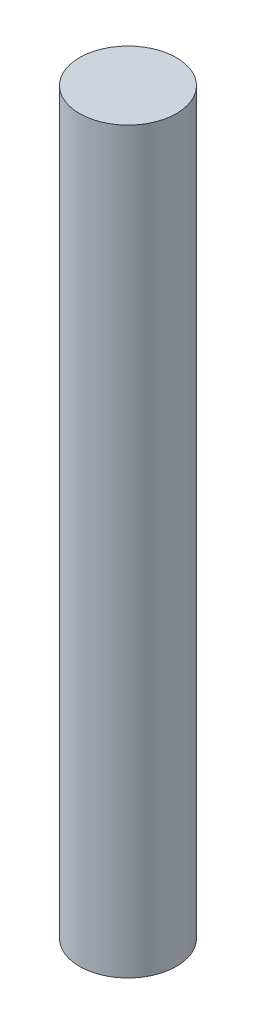
ISO-10303-21;
HEADER;
FILE_DESCRIPTION(('STEP AP214'),'2;1');
FILE_NAME('part.step','',(''),(''),'','','');
FILE_SCHEMA(('AUTOMOTIVE_DESIGN { 1 0 10303 214 1 1 1 1 }'));
ENDSEC;
DATA;
#1=APPLICATION_CONTEXT('core data for automotive mechanical design processes');
#2=APPLICATION_PROTOCOL_DEFINITION('international standard','automotive_design',2000,#1);
#3=PRODUCT_CONTEXT('',#1,'mechanical');
#4=PRODUCT('Part','Part','',(#3));
#5=PRODUCT_RELATED_PRODUCT_CATEGORY('part','',(#4));
#6=PRODUCT_DEFINITION_FORMATION('','',#4);
#7=PRODUCT_DEFINITION_CONTEXT('part definition',#1,'design');
#8=PRODUCT_DEFINITION('design','',#6,#7);
#9=PRODUCT_DEFINITION_SHAPE('','',#8);
#10=(LENGTH_UNIT() NAMED_UNIT(*) SI_UNIT(.MILLI.,.METRE.));
#11=(NAMED_UNIT(*) PLANE_ANGLE_UNIT() SI_UNIT($,.RADIAN.));
#12=(NAMED_UNIT(*) SI_UNIT($,.STERADIAN.) SOLID_ANGLE_UNIT());
#13=UNCERTAINTY_MEASURE_WITH_UNIT(LENGTH_MEASURE(1.E-05),#10,'distance_accuracy_value','');
#14=(GEOMETRIC_REPRESENTATION_CONTEXT(3) GLOBAL_UNCERTAINTY_ASSIGNED_CONTEXT((#13)) GLOBAL_UNIT_ASSIGNED_CONTEXT((#10,
#11,#12)) REPRESENTATION_CONTEXT('',''));
#15=CARTESIAN_POINT('',(0.,0.,0.));
#16=DIRECTION('',(0.,0.,1.));
#17=DIRECTION('',(1.,0.,0.));
#18=AXIS2_PLACEMENT_3D('',#15,#16,#17);
#19=CARTESIAN_POINT('',(0.,190.5,0.));
#20=DIRECTION('',(0.,-1.,0.));
#21=DIRECTION('',(0.,0.,-1.));
#22=AXIS2_PLACEMENT_3D('',#19,#20,#21);
#23=CYLINDRICAL_SURFACE('',#22,12.5);
#24=CARTESIAN_POINT('',(0.,190.5,0.));
#25=DIRECTION('',(0.,1.,0.));
#26=DIRECTION('',(0.,0.,1.));
#27=AXIS2_PLACEMENT_3D('',#24,#25,#26);
#28=CIRCLE('',#27,12.5);
#29=CARTESIAN_POINT('',(0.,190.5,12.5));
#30=VERTEX_POINT('',#29);
#31=EDGE_CURVE('E10',#30,#30,#28,.T.);
#32=ORIENTED_EDGE('',*,*,#31,.F.);
#33=EDGE_LOOP('',(#32));
#34=FACE_BOUND('',#33,.T.);
#35=CARTESIAN_POINT('',(0.,0.,0.));
#36=DIRECTION('',(0.,1.,0.));
#37=DIRECTION('',(0.,0.,1.));
#38=AXIS2_PLACEMENT_3D('',#35,#36,#37);
#39=CIRCLE('',#38,12.5);
#40=CARTESIAN_POINT('',(0.,0.,12.5));
#41=VERTEX_POINT('',#40);
#42=EDGE_CURVE('E40',#41,#41,#39,.T.);
#43=ORIENTED_EDGE('',*,*,#42,.T.);
#44=EDGE_LOOP('',(#43));
#45=FACE_BOUND('',#44,.T.);
#46=ADVANCED_FACE('F37',(#34,#45),#23,.T.);
#47=CARTESIAN_POINT('',(0.,190.5,0.));
#48=DIRECTION('',(0.,1.,0.));
#49=DIRECTION('',(0.,0.,1.));
#50=AXIS2_PLACEMENT_3D('',#47,#48,#49);
#51=PLANE('',#50);
#52=ORIENTED_EDGE('',*,*,#31,.T.);
#53=EDGE_LOOP('',(#52));
#54=FACE_BOUND('',#53,.T.);
#55=ADVANCED_FACE('F52',(#54),#51,.T.);
#56=CARTESIAN_POINT('',(0.,0.,0.));
#57=DIRECTION('',(0.,1.,0.));
#58=DIRECTION('',(0.,0.,1.));
#59=AXIS2_PLACEMENT_3D('',#56,#57,#58);
#60=PLANE('',#59);
#61=ORIENTED_EDGE('',*,*,#42,.F.);
#62=EDGE_LOOP('',(#61));
#63=FACE_BOUND('',#62,.T.);
#64=ADVANCED_FACE('F50',(#63),#60,.F.);
#65=CLOSED_SHELL('',(#46,#55,#64));
#66=MANIFOLD_SOLID_BREP('B2',#65);
#67=ADVANCED_BREP_SHAPE_REPRESENTATION('',(#18,#66),#14);
#68=SHAPE_DEFINITION_REPRESENTATION(#9,#67);
ENDSEC;
END-ISO-10303-21;
